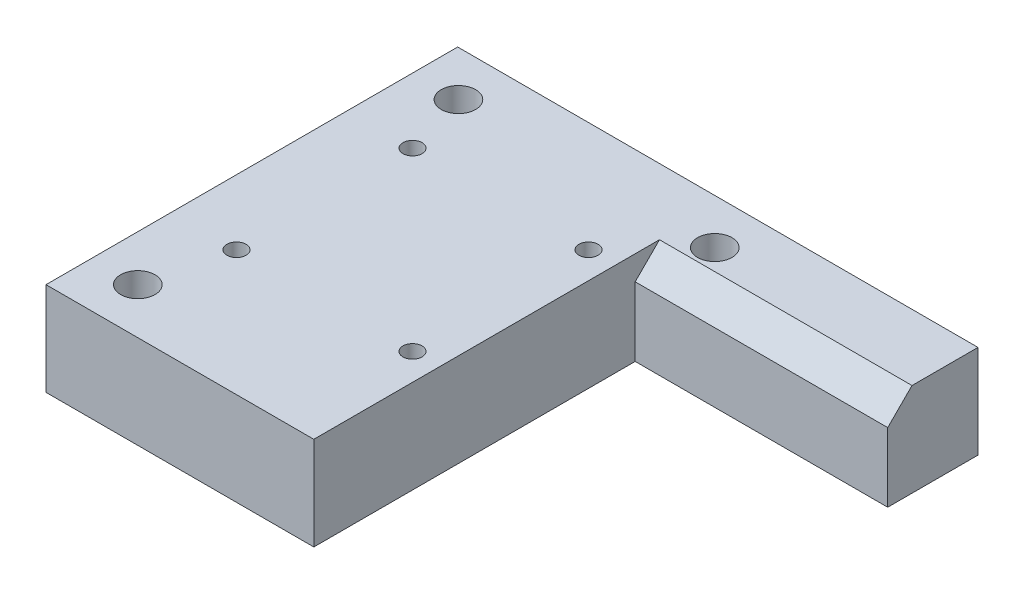
ISO-10303-21;
HEADER;
FILE_DESCRIPTION(('STEP AP214'),'2;1');
FILE_NAME('part.step','',(''),(''),'','','');
FILE_SCHEMA(('AUTOMOTIVE_DESIGN { 1 0 10303 214 1 1 1 1 }'));
ENDSEC;
DATA;
#1=APPLICATION_CONTEXT('core data for automotive mechanical design processes');
#2=APPLICATION_PROTOCOL_DEFINITION('international standard','automotive_design',2000,#1);
#3=PRODUCT_CONTEXT('',#1,'mechanical');
#4=PRODUCT('Part','Part','',(#3));
#5=PRODUCT_RELATED_PRODUCT_CATEGORY('part','',(#4));
#6=PRODUCT_DEFINITION_FORMATION('','',#4);
#7=PRODUCT_DEFINITION_CONTEXT('part definition',#1,'design');
#8=PRODUCT_DEFINITION('design','',#6,#7);
#9=PRODUCT_DEFINITION_SHAPE('','',#8);
#10=(LENGTH_UNIT() NAMED_UNIT(*) SI_UNIT(.MILLI.,.METRE.));
#11=(NAMED_UNIT(*) PLANE_ANGLE_UNIT() SI_UNIT($,.RADIAN.));
#12=(NAMED_UNIT(*) SI_UNIT($,.STERADIAN.) SOLID_ANGLE_UNIT());
#13=UNCERTAINTY_MEASURE_WITH_UNIT(LENGTH_MEASURE(1.E-05),#10,'distance_accuracy_value','');
#14=(GEOMETRIC_REPRESENTATION_CONTEXT(3) GLOBAL_UNCERTAINTY_ASSIGNED_CONTEXT((#13)) GLOBAL_UNIT_ASSIGNED_CONTEXT((#10,
#11,#12)) REPRESENTATION_CONTEXT('',''));
#15=CARTESIAN_POINT('',(0.,0.,0.));
#16=DIRECTION('',(0.,0.,1.));
#17=DIRECTION('',(1.,0.,0.));
#18=AXIS2_PLACEMENT_3D('',#15,#16,#17);
#19=CARTESIAN_POINT('',(0.,0.,11.8));
#20=DIRECTION('',(1.,0.,0.));
#21=DIRECTION('',(0.,1.,0.));
#22=AXIS2_PLACEMENT_3D('',#19,#20,#21);
#23=PLANE('',#22);
#24=DIRECTION('',(0.,-1.,0.));
#25=VECTOR('',#24,1.);
#26=CARTESIAN_POINT('',(0.,0.,0.));
#27=LINE('',#26,#25);
#28=CARTESIAN_POINT('',(0.,12.192,0.));
#29=VERTEX_POINT('',#28);
#30=CARTESIAN_POINT('',(0.,0.,0.));
#31=VERTEX_POINT('',#30);
#32=EDGE_CURVE('E111',#29,#31,#27,.T.);
#33=ORIENTED_EDGE('',*,*,#32,.T.);
#34=DIRECTION('',(0.,0.,1.));
#35=VECTOR('',#34,1.);
#36=CARTESIAN_POINT('',(0.,0.,0.));
#37=LINE('',#36,#35);
#38=CARTESIAN_POINT('',(0.,0.,53.8));
#39=VERTEX_POINT('',#38);
#40=EDGE_CURVE('E95',#31,#39,#37,.T.);
#41=ORIENTED_EDGE('',*,*,#40,.T.);
#42=DIRECTION('',(0.,-1.,0.));
#43=VECTOR('',#42,1.);
#44=CARTESIAN_POINT('',(0.,0.,53.8));
#45=LINE('',#44,#43);
#46=CARTESIAN_POINT('',(0.,12.192,53.8));
#47=VERTEX_POINT('',#46);
#48=EDGE_CURVE('E120',#47,#39,#45,.T.);
#49=ORIENTED_EDGE('',*,*,#48,.F.);
#50=DIRECTION('',(0.,0.,-1.));
#51=VECTOR('',#50,1.);
#52=CARTESIAN_POINT('',(0.,12.192,11.8));
#53=LINE('',#52,#51);
#54=EDGE_CURVE('E116',#47,#29,#53,.T.);
#55=ORIENTED_EDGE('',*,*,#54,.T.);
#56=EDGE_LOOP('',(#33,#41,#49,#55));
#57=FACE_BOUND('',#56,.T.);
#58=ADVANCED_FACE('F36',(#57),#23,.F.);
#59=CARTESIAN_POINT('',(68.,0.,11.8));
#60=DIRECTION('',(-1.,0.,0.));
#61=DIRECTION('',(0.,0.,1.));
#62=AXIS2_PLACEMENT_3D('',#59,#60,#61);
#63=PLANE('',#62);
#64=DIRECTION('',(0.,1.,0.));
#65=VECTOR('',#64,1.);
#66=CARTESIAN_POINT('',(68.,0.,11.8));
#67=LINE('',#66,#65);
#68=CARTESIAN_POINT('',(68.,0.,11.8));
#69=VERTEX_POINT('',#68);
#70=CARTESIAN_POINT('',(68.,9.017,11.8));
#71=VERTEX_POINT('',#70);
#72=EDGE_CURVE('E11',#69,#71,#67,.T.);
#73=ORIENTED_EDGE('',*,*,#72,.F.);
#74=DIRECTION('',(0.,0.,-1.));
#75=VECTOR('',#74,1.);
#76=CARTESIAN_POINT('',(68.,0.,11.8));
#77=LINE('',#76,#75);
#78=CARTESIAN_POINT('',(68.,0.,0.));
#79=VERTEX_POINT('',#78);
#80=EDGE_CURVE('E144',#69,#79,#77,.T.);
#81=ORIENTED_EDGE('',*,*,#80,.T.);
#82=DIRECTION('',(0.,1.,0.));
#83=VECTOR('',#82,1.);
#84=CARTESIAN_POINT('',(68.,0.,0.));
#85=LINE('',#84,#83);
#86=CARTESIAN_POINT('',(68.,12.192,0.));
#87=VERTEX_POINT('',#86);
#88=EDGE_CURVE('E45',#79,#87,#85,.T.);
#89=ORIENTED_EDGE('',*,*,#88,.T.);
#90=DIRECTION('',(0.,0.,-1.));
#91=VECTOR('',#90,1.);
#92=CARTESIAN_POINT('',(68.,12.192,11.8));
#93=LINE('',#92,#91);
#94=CARTESIAN_POINT('',(68.,12.192,8.62499999999999));
#95=VERTEX_POINT('',#94);
#96=EDGE_CURVE('E191',#95,#87,#93,.T.);
#97=ORIENTED_EDGE('',*,*,#96,.F.);
#98=DIRECTION('',(0.,0.707106781186546,-0.707106781186549));
#99=VECTOR('',#98,1.);
#100=CARTESIAN_POINT('',(68.,9.017,11.8));
#101=LINE('',#100,#99);
#102=EDGE_CURVE('E208',#71,#95,#101,.T.);
#103=ORIENTED_EDGE('',*,*,#102,.F.);
#104=EDGE_LOOP('',(#73,#81,#89,#97,#103));
#105=FACE_BOUND('',#104,.T.);
#106=ADVANCED_FACE('F229',(#105),#63,.F.);
#107=CARTESIAN_POINT('',(0.,0.,11.8));
#108=DIRECTION('',(0.,0.,1.));
#109=DIRECTION('',(1.,0.,0.));
#110=AXIS2_PLACEMENT_3D('',#107,#108,#109);
#111=PLANE('',#110);
#112=DIRECTION('',(-1.,0.,0.));
#113=VECTOR('',#112,1.);
#114=CARTESIAN_POINT('',(0.,0.,11.8));
#115=LINE('',#114,#113);
#116=CARTESIAN_POINT('',(35.,0.,11.8));
#117=VERTEX_POINT('',#116);
#118=EDGE_CURVE('E142',#69,#117,#115,.T.);
#119=ORIENTED_EDGE('',*,*,#118,.F.);
#120=ORIENTED_EDGE('',*,*,#72,.T.);
#121=DIRECTION('',(1.,0.,0.));
#122=VECTOR('',#121,1.);
#123=CARTESIAN_POINT('',(68.,9.017,11.8));
#124=LINE('',#123,#122);
#125=CARTESIAN_POINT('',(35.,9.017,11.8));
#126=VERTEX_POINT('',#125);
#127=EDGE_CURVE('E195',#126,#71,#124,.T.);
#128=ORIENTED_EDGE('',*,*,#127,.F.);
#129=DIRECTION('',(0.,1.,0.));
#130=VECTOR('',#129,1.);
#131=CARTESIAN_POINT('',(35.,0.,11.8));
#132=LINE('',#131,#130);
#133=EDGE_CURVE('E39',#117,#126,#132,.T.);
#134=ORIENTED_EDGE('',*,*,#133,.F.);
#135=EDGE_LOOP('',(#119,#120,#128,#134));
#136=FACE_BOUND('',#135,.T.);
#137=ADVANCED_FACE('F226',(#136),#111,.T.);
#138=CARTESIAN_POINT('',(0.,0.,0.));
#139=DIRECTION('',(0.,0.,1.));
#140=DIRECTION('',(1.,0.,0.));
#141=AXIS2_PLACEMENT_3D('',#138,#139,#140);
#142=PLANE('',#141);
#143=ORIENTED_EDGE('',*,*,#88,.F.);
#144=DIRECTION('',(-1.,0.,0.));
#145=VECTOR('',#144,1.);
#146=CARTESIAN_POINT('',(0.,0.,0.));
#147=LINE('',#146,#145);
#148=EDGE_CURVE('E99',#79,#31,#147,.T.);
#149=ORIENTED_EDGE('',*,*,#148,.T.);
#150=ORIENTED_EDGE('',*,*,#32,.F.);
#151=DIRECTION('',(1.,0.,0.));
#152=VECTOR('',#151,1.);
#153=CARTESIAN_POINT('',(0.,12.192,0.));
#154=LINE('',#153,#152);
#155=EDGE_CURVE('E189',#29,#87,#154,.T.);
#156=ORIENTED_EDGE('',*,*,#155,.T.);
#157=EDGE_LOOP('',(#143,#149,#150,#156));
#158=FACE_BOUND('',#157,.T.);
#159=ADVANCED_FACE('F109',(#158),#142,.F.);
#160=CARTESIAN_POINT('',(39.5,-7.,5.9));
#161=DIRECTION('',(0.,1.,0.));
#162=DIRECTION('',(0.,0.,1.));
#163=AXIS2_PLACEMENT_3D('',#160,#161,#162);
#164=CYLINDRICAL_SURFACE('',#163,4.125);
#165=CARTESIAN_POINT('',(39.5,0.,5.9));
#166=DIRECTION('',(0.,1.,0.));
#167=DIRECTION('',(0.,0.,1.));
#168=AXIS2_PLACEMENT_3D('',#165,#166,#167);
#169=CIRCLE('',#168,4.125);
#170=CARTESIAN_POINT('',(39.5,0.,10.025));
#171=VERTEX_POINT('',#170);
#172=EDGE_CURVE('E149',#171,#171,#169,.F.);
#173=ORIENTED_EDGE('',*,*,#172,.T.);
#174=EDGE_LOOP('',(#173));
#175=FACE_BOUND('',#174,.T.);
#176=CARTESIAN_POINT('',(39.5,7.,5.9));
#177=DIRECTION('',(0.,1.,0.));
#178=DIRECTION('',(0.,0.,1.));
#179=AXIS2_PLACEMENT_3D('',#176,#177,#178);
#180=CIRCLE('',#179,4.125);
#181=CARTESIAN_POINT('',(39.5,7.,10.025));
#182=VERTEX_POINT('',#181);
#183=EDGE_CURVE('E179',#182,#182,#180,.T.);
#184=ORIENTED_EDGE('',*,*,#183,.T.);
#185=EDGE_LOOP('',(#184));
#186=FACE_BOUND('',#185,.T.);
#187=ADVANCED_FACE('F256',(#175,#186),#164,.F.);
#188=CARTESIAN_POINT('',(6.,-7.,5.90000000000001));
#189=DIRECTION('',(0.,1.,0.));
#190=DIRECTION('',(0.,0.,1.));
#191=AXIS2_PLACEMENT_3D('',#188,#189,#190);
#192=CYLINDRICAL_SURFACE('',#191,4.125);
#193=CARTESIAN_POINT('',(6.,0.,5.90000000000001));
#194=DIRECTION('',(0.,1.,0.));
#195=DIRECTION('',(0.,0.,1.));
#196=AXIS2_PLACEMENT_3D('',#193,#194,#195);
#197=CIRCLE('',#196,4.125);
#198=CARTESIAN_POINT('',(6.,0.,10.025));
#199=VERTEX_POINT('',#198);
#200=EDGE_CURVE('E146',#199,#199,#197,.F.);
#201=ORIENTED_EDGE('',*,*,#200,.T.);
#202=EDGE_LOOP('',(#201));
#203=FACE_BOUND('',#202,.T.);
#204=CARTESIAN_POINT('',(6.,7.,5.90000000000001));
#205=DIRECTION('',(0.,1.,0.));
#206=DIRECTION('',(0.,0.,1.));
#207=AXIS2_PLACEMENT_3D('',#204,#205,#206);
#208=CIRCLE('',#207,4.125);
#209=CARTESIAN_POINT('',(6.,7.,10.025));
#210=VERTEX_POINT('',#209);
#211=EDGE_CURVE('E175',#210,#210,#208,.T.);
#212=ORIENTED_EDGE('',*,*,#211,.T.);
#213=EDGE_LOOP('',(#212));
#214=FACE_BOUND('',#213,.T.);
#215=ADVANCED_FACE('F244',(#203,#214),#192,.F.);
#216=CARTESIAN_POINT('',(35.,0.,53.8));
#217=DIRECTION('',(-1.,0.,0.));
#218=DIRECTION('',(0.,0.,1.));
#219=AXIS2_PLACEMENT_3D('',#216,#217,#218);
#220=PLANE('',#219);
#221=DIRECTION('',(0.,1.,0.));
#222=VECTOR('',#221,1.);
#223=CARTESIAN_POINT('',(35.,0.,53.8));
#224=LINE('',#223,#222);
#225=CARTESIAN_POINT('',(35.,0.,53.8));
#226=VERTEX_POINT('',#225);
#227=CARTESIAN_POINT('',(35.,12.192,53.8));
#228=VERTEX_POINT('',#227);
#229=EDGE_CURVE('E117',#226,#228,#224,.T.);
#230=ORIENTED_EDGE('',*,*,#229,.F.);
#231=DIRECTION('',(0.,0.,-1.));
#232=VECTOR('',#231,1.);
#233=CARTESIAN_POINT('',(35.,0.,53.8));
#234=LINE('',#233,#232);
#235=EDGE_CURVE('E53',#226,#117,#234,.T.);
#236=ORIENTED_EDGE('',*,*,#235,.T.);
#237=ORIENTED_EDGE('',*,*,#133,.T.);
#238=DIRECTION('',(0.,-0.707106781186546,0.707106781186549));
#239=VECTOR('',#238,1.);
#240=CARTESIAN_POINT('',(35.,-16.4915,37.3085000000001));
#241=LINE('',#240,#239);
#242=CARTESIAN_POINT('',(35.,12.192,8.62500000000001));
#243=VERTEX_POINT('',#242);
#244=EDGE_CURVE('E61',#243,#126,#241,.T.);
#245=ORIENTED_EDGE('',*,*,#244,.F.);
#246=DIRECTION('',(0.,0.,-1.));
#247=VECTOR('',#246,1.);
#248=CARTESIAN_POINT('',(35.,12.192,53.8));
#249=LINE('',#248,#247);
#250=EDGE_CURVE('E174',#228,#243,#249,.T.);
#251=ORIENTED_EDGE('',*,*,#250,.F.);
#252=EDGE_LOOP('',(#230,#236,#237,#245,#251));
#253=FACE_BOUND('',#252,.T.);
#254=ADVANCED_FACE('F218',(#253),#220,.F.);
#255=CARTESIAN_POINT('',(0.,0.,53.8));
#256=DIRECTION('',(0.,0.,1.));
#257=DIRECTION('',(1.,0.,0.));
#258=AXIS2_PLACEMENT_3D('',#255,#256,#257);
#259=PLANE('',#258);
#260=DIRECTION('',(-1.,0.,0.));
#261=VECTOR('',#260,1.);
#262=CARTESIAN_POINT('',(0.,0.,53.8));
#263=LINE('',#262,#261);
#264=EDGE_CURVE('E101',#226,#39,#263,.T.);
#265=ORIENTED_EDGE('',*,*,#264,.F.);
#266=ORIENTED_EDGE('',*,*,#229,.T.);
#267=DIRECTION('',(1.,0.,0.));
#268=VECTOR('',#267,1.);
#269=CARTESIAN_POINT('',(0.,12.192,53.8));
#270=LINE('',#269,#268);
#271=EDGE_CURVE('E171',#47,#228,#270,.T.);
#272=ORIENTED_EDGE('',*,*,#271,.F.);
#273=ORIENTED_EDGE('',*,*,#48,.T.);
#274=EDGE_LOOP('',(#265,#266,#272,#273));
#275=FACE_BOUND('',#274,.T.);
#276=ADVANCED_FACE('F233',(#275),#259,.T.);
#277=CARTESIAN_POINT('',(6.,-7.,47.8));
#278=DIRECTION('',(0.,1.,0.));
#279=DIRECTION('',(0.,0.,1.));
#280=AXIS2_PLACEMENT_3D('',#277,#278,#279);
#281=CYLINDRICAL_SURFACE('',#280,4.125);
#282=CARTESIAN_POINT('',(6.,0.,47.8));
#283=DIRECTION('',(0.,1.,0.));
#284=DIRECTION('',(0.,0.,1.));
#285=AXIS2_PLACEMENT_3D('',#282,#283,#284);
#286=CIRCLE('',#285,4.125);
#287=CARTESIAN_POINT('',(6.,0.,51.925));
#288=VERTEX_POINT('',#287);
#289=EDGE_CURVE('E138',#288,#288,#286,.F.);
#290=ORIENTED_EDGE('',*,*,#289,.T.);
#291=EDGE_LOOP('',(#290));
#292=FACE_BOUND('',#291,.T.);
#293=CARTESIAN_POINT('',(6.,7.,47.8));
#294=DIRECTION('',(0.,1.,0.));
#295=DIRECTION('',(0.,0.,1.));
#296=AXIS2_PLACEMENT_3D('',#293,#294,#295);
#297=CIRCLE('',#296,4.125);
#298=CARTESIAN_POINT('',(6.,7.,51.925));
#299=VERTEX_POINT('',#298);
#300=EDGE_CURVE('E164',#299,#299,#297,.T.);
#301=ORIENTED_EDGE('',*,*,#300,.T.);
#302=EDGE_LOOP('',(#301));
#303=FACE_BOUND('',#302,.T.);
#304=ADVANCED_FACE('F235',(#292,#303),#281,.F.);
#305=CARTESIAN_POINT('',(8.50000000000008,-12.19305,14.4002415116128));
#306=DIRECTION('',(0.,1.,0.));
#307=DIRECTION('',(0.,0.,1.));
#308=AXIS2_PLACEMENT_3D('',#305,#306,#307);
#309=CYLINDRICAL_SURFACE('',#308,1.24999999999369);
#310=CARTESIAN_POINT('',(8.50000000000008,0.,14.4002415116128));
#311=DIRECTION('',(0.,1.,0.));
#312=DIRECTION('',(0.,0.,1.));
#313=AXIS2_PLACEMENT_3D('',#310,#311,#312);
#314=CIRCLE('',#313,1.24999999999369);
#315=CARTESIAN_POINT('',(8.50000000000008,0.,15.6502415116065));
#316=VERTEX_POINT('',#315);
#317=EDGE_CURVE('E132',#316,#316,#314,.F.);
#318=ORIENTED_EDGE('',*,*,#317,.T.);
#319=EDGE_LOOP('',(#318));
#320=FACE_BOUND('',#319,.T.);
#321=CARTESIAN_POINT('',(8.50000000000008,12.192,14.4002415116128));
#322=DIRECTION('',(0.,1.,0.));
#323=DIRECTION('',(0.,0.,1.));
#324=AXIS2_PLACEMENT_3D('',#321,#322,#323);
#325=CIRCLE('',#324,1.24999999999369);
#326=CARTESIAN_POINT('',(8.50000000000008,12.192,15.6502415116065));
#327=VERTEX_POINT('',#326);
#328=EDGE_CURVE('E161',#327,#327,#325,.F.);
#329=ORIENTED_EDGE('',*,*,#328,.F.);
#330=EDGE_LOOP('',(#329));
#331=FACE_BOUND('',#330,.T.);
#332=ADVANCED_FACE('F241',(#320,#331),#309,.F.);
#333=CARTESIAN_POINT('',(8.497816511636,-12.19305,37.4024249999771));
#334=DIRECTION('',(0.,1.,0.));
#335=DIRECTION('',(0.,0.,1.));
#336=AXIS2_PLACEMENT_3D('',#333,#334,#335);
#337=CYLINDRICAL_SURFACE('',#336,1.2499999999937);
#338=CARTESIAN_POINT('',(8.497816511636,0.,37.4024249999771));
#339=DIRECTION('',(0.,1.,0.));
#340=DIRECTION('',(0.,0.,1.));
#341=AXIS2_PLACEMENT_3D('',#338,#339,#340);
#342=CIRCLE('',#341,1.2499999999937);
#343=CARTESIAN_POINT('',(8.497816511636,0.,38.6524249999708));
#344=VERTEX_POINT('',#343);
#345=EDGE_CURVE('E127',#344,#344,#342,.F.);
#346=ORIENTED_EDGE('',*,*,#345,.T.);
#347=EDGE_LOOP('',(#346));
#348=FACE_BOUND('',#347,.T.);
#349=CARTESIAN_POINT('',(8.497816511636,12.192,37.4024249999771));
#350=DIRECTION('',(0.,1.,0.));
#351=DIRECTION('',(0.,0.,1.));
#352=AXIS2_PLACEMENT_3D('',#349,#350,#351);
#353=CIRCLE('',#352,1.2499999999937);
#354=CARTESIAN_POINT('',(8.497816511636,12.192,38.6524249999708));
#355=VERTEX_POINT('',#354);
#356=EDGE_CURVE('E158',#355,#355,#353,.F.);
#357=ORIENTED_EDGE('',*,*,#356,.F.);
#358=EDGE_LOOP('',(#357));
#359=FACE_BOUND('',#358,.T.);
#360=ADVANCED_FACE('F304',(#348,#359),#337,.F.);
#361=CARTESIAN_POINT('',(31.5000000000003,-12.19305,37.4046084883411));
#362=DIRECTION('',(0.,1.,0.));
#363=DIRECTION('',(0.,0.,1.));
#364=AXIS2_PLACEMENT_3D('',#361,#362,#363);
#365=CYLINDRICAL_SURFACE('',#364,1.24999999999371);
#366=CARTESIAN_POINT('',(31.5000000000003,0.,37.4046084883411));
#367=DIRECTION('',(0.,1.,0.));
#368=DIRECTION('',(0.,0.,1.));
#369=AXIS2_PLACEMENT_3D('',#366,#367,#368);
#370=CIRCLE('',#369,1.24999999999371);
#371=CARTESIAN_POINT('',(31.5000000000003,0.,38.6546084883348));
#372=VERTEX_POINT('',#371);
#373=EDGE_CURVE('E123',#372,#372,#370,.F.);
#374=ORIENTED_EDGE('',*,*,#373,.T.);
#375=EDGE_LOOP('',(#374));
#376=FACE_BOUND('',#375,.T.);
#377=CARTESIAN_POINT('',(31.5000000000003,12.192,37.4046084883411));
#378=DIRECTION('',(0.,1.,0.));
#379=DIRECTION('',(0.,0.,1.));
#380=AXIS2_PLACEMENT_3D('',#377,#378,#379);
#381=CIRCLE('',#380,1.24999999999371);
#382=CARTESIAN_POINT('',(31.5000000000003,12.192,38.6546084883348));
#383=VERTEX_POINT('',#382);
#384=EDGE_CURVE('E155',#383,#383,#381,.F.);
#385=ORIENTED_EDGE('',*,*,#384,.F.);
#386=EDGE_LOOP('',(#385));
#387=FACE_BOUND('',#386,.T.);
#388=ADVANCED_FACE('F301',(#376,#387),#365,.F.);
#389=CARTESIAN_POINT('',(31.5021834883644,-12.19305,14.402424999977));
#390=DIRECTION('',(0.,1.,0.));
#391=DIRECTION('',(0.,0.,1.));
#392=AXIS2_PLACEMENT_3D('',#389,#390,#391);
#393=CYLINDRICAL_SURFACE('',#392,1.2499999999937);
#394=CARTESIAN_POINT('',(31.5021834883644,0.,14.402424999977));
#395=DIRECTION('',(0.,1.,0.));
#396=DIRECTION('',(0.,0.,1.));
#397=AXIS2_PLACEMENT_3D('',#394,#395,#396);
#398=CIRCLE('',#397,1.2499999999937);
#399=CARTESIAN_POINT('',(31.5021834883644,0.,15.6524249999707));
#400=VERTEX_POINT('',#399);
#401=EDGE_CURVE('E105',#400,#400,#398,.F.);
#402=ORIENTED_EDGE('',*,*,#401,.T.);
#403=EDGE_LOOP('',(#402));
#404=FACE_BOUND('',#403,.T.);
#405=CARTESIAN_POINT('',(31.5021834883644,12.192,14.402424999977));
#406=DIRECTION('',(0.,1.,0.));
#407=DIRECTION('',(0.,0.,1.));
#408=AXIS2_PLACEMENT_3D('',#405,#406,#407);
#409=CIRCLE('',#408,1.2499999999937);
#410=CARTESIAN_POINT('',(31.5021834883644,12.192,15.6524249999707));
#411=VERTEX_POINT('',#410);
#412=EDGE_CURVE('E152',#411,#411,#409,.F.);
#413=ORIENTED_EDGE('',*,*,#412,.F.);
#414=EDGE_LOOP('',(#413));
#415=FACE_BOUND('',#414,.T.);
#416=ADVANCED_FACE('F289',(#404,#415),#393,.F.);
#417=CARTESIAN_POINT('',(6.,12.19205,47.8));
#418=DIRECTION('',(0.,-1.,0.));
#419=DIRECTION('',(0.,0.,1.));
#420=AXIS2_PLACEMENT_3D('',#417,#418,#419);
#421=CYLINDRICAL_SURFACE('',#420,2.25000000000001);
#422=CARTESIAN_POINT('',(6.,12.192,47.8));
#423=DIRECTION('',(0.,1.,0.));
#424=DIRECTION('',(0.,0.,1.));
#425=AXIS2_PLACEMENT_3D('',#422,#423,#424);
#426=CIRCLE('',#425,2.25000000000001);
#427=CARTESIAN_POINT('',(6.,12.192,50.05));
#428=VERTEX_POINT('',#427);
#429=EDGE_CURVE('E168',#428,#428,#426,.T.);
#430=CARTESIAN_POINT('',(6.,7.,47.8));
#431=DIRECTION('',(0.,1.,0.));
#432=DIRECTION('',(0.,0.,1.));
#433=AXIS2_PLACEMENT_3D('',#430,#431,#432);
#434=CIRCLE('',#433,2.25000000000001);
#435=CARTESIAN_POINT('',(6.,7.,50.05));
#436=VERTEX_POINT('',#435);
#437=EDGE_CURVE('E167',#436,#436,#434,.F.);
#438=CARTESIAN_POINT('',(6.,12.192,50.05));
#439=CARTESIAN_POINT('',(6.,12.1379166666667,50.05));
#440=CARTESIAN_POINT('',(6.,12.0838333333333,50.05));
#441=CARTESIAN_POINT('',(6.,11.9756666666667,50.05));
#442=CARTESIAN_POINT('',(6.,11.9215833333333,50.05));
#443=CARTESIAN_POINT('',(6.,11.8134166666667,50.05));
#444=CARTESIAN_POINT('',(6.,11.7593333333333,50.05));
#445=CARTESIAN_POINT('',(6.,11.6511666666667,50.05));
#446=CARTESIAN_POINT('',(6.,11.5970833333333,50.05));
#447=CARTESIAN_POINT('',(6.,11.4889166666667,50.05));
#448=CARTESIAN_POINT('',(6.,11.4348333333333,50.05));
#449=CARTESIAN_POINT('',(6.,11.3266666666667,50.05));
#450=CARTESIAN_POINT('',(6.,11.2725833333333,50.05));
#451=CARTESIAN_POINT('',(6.,11.1644166666667,50.05));
#452=CARTESIAN_POINT('',(6.,11.1103333333333,50.05));
#453=CARTESIAN_POINT('',(6.,11.0021666666667,50.05));
#454=CARTESIAN_POINT('',(6.,10.9480833333333,50.05));
#455=CARTESIAN_POINT('',(6.,10.8399166666667,50.05));
#456=CARTESIAN_POINT('',(6.,10.7858333333333,50.05));
#457=CARTESIAN_POINT('',(6.,10.6776666666667,50.05));
#458=CARTESIAN_POINT('',(6.,10.6235833333333,50.05));
#459=CARTESIAN_POINT('',(6.,10.5154166666667,50.05));
#460=CARTESIAN_POINT('',(6.,10.4613333333333,50.05));
#461=CARTESIAN_POINT('',(6.,10.3531666666667,50.05));
#462=CARTESIAN_POINT('',(6.,10.2990833333333,50.05));
#463=CARTESIAN_POINT('',(6.,10.1909166666667,50.05));
#464=CARTESIAN_POINT('',(6.,10.1368333333333,50.05));
#465=CARTESIAN_POINT('',(6.,10.0286666666667,50.05));
#466=CARTESIAN_POINT('',(6.,9.97458333333333,50.05));
#467=CARTESIAN_POINT('',(6.,9.86641666666667,50.05));
#468=CARTESIAN_POINT('',(6.,9.81233333333333,50.05));
#469=CARTESIAN_POINT('',(6.,9.70416666666667,50.05));
#470=CARTESIAN_POINT('',(6.,9.65008333333333,50.05));
#471=CARTESIAN_POINT('',(6.,9.54191666666667,50.05));
#472=CARTESIAN_POINT('',(6.,9.48783333333333,50.05));
#473=CARTESIAN_POINT('',(6.,9.37966666666667,50.05));
#474=CARTESIAN_POINT('',(6.,9.32558333333333,50.05));
#475=CARTESIAN_POINT('',(6.,9.21741666666667,50.05));
#476=CARTESIAN_POINT('',(6.,9.16333333333333,50.05));
#477=CARTESIAN_POINT('',(6.,9.05516666666667,50.05));
#478=CARTESIAN_POINT('',(6.,9.00108333333333,50.05));
#479=CARTESIAN_POINT('',(6.,8.89291666666667,50.05));
#480=CARTESIAN_POINT('',(6.,8.83883333333333,50.05));
#481=CARTESIAN_POINT('',(6.,8.73066666666667,50.05));
#482=CARTESIAN_POINT('',(6.,8.67658333333333,50.05));
#483=CARTESIAN_POINT('',(6.,8.56841666666667,50.05));
#484=CARTESIAN_POINT('',(6.,8.51433333333333,50.05));
#485=CARTESIAN_POINT('',(6.,8.40616666666667,50.05));
#486=CARTESIAN_POINT('',(6.,8.35208333333333,50.05));
#487=CARTESIAN_POINT('',(6.,8.24391666666667,50.05));
#488=CARTESIAN_POINT('',(6.,8.18983333333333,50.05));
#489=CARTESIAN_POINT('',(6.,8.08166666666667,50.05));
#490=CARTESIAN_POINT('',(6.,8.02758333333333,50.05));
#491=CARTESIAN_POINT('',(6.,7.91941666666667,50.05));
#492=CARTESIAN_POINT('',(6.,7.86533333333333,50.05));
#493=CARTESIAN_POINT('',(6.,7.75716666666667,50.05));
#494=CARTESIAN_POINT('',(6.,7.70308333333333,50.05));
#495=CARTESIAN_POINT('',(6.,7.59491666666667,50.05));
#496=CARTESIAN_POINT('',(6.,7.54083333333333,50.05));
#497=CARTESIAN_POINT('',(6.,7.43266666666667,50.05));
#498=CARTESIAN_POINT('',(6.,7.37858333333333,50.05));
#499=CARTESIAN_POINT('',(6.,7.27041666666667,50.05));
#500=CARTESIAN_POINT('',(6.,7.21633333333333,50.05));
#501=CARTESIAN_POINT('',(6.,7.10816666666667,50.05));
#502=CARTESIAN_POINT('',(6.,7.05408333333333,50.05));
#503=CARTESIAN_POINT('',(6.,7.,50.05));
#504=B_SPLINE_CURVE_WITH_KNOTS('',3,(#438,#439,#440,#441,#442,#443,#444,#445,#446,#447,#448,
#449,#450,#451,#452,#453,#454,#455,#456,#457,#458,#459,#460,#461,#462,#463,#464,#465,#466,#467,
#468,#469,#470,#471,#472,#473,#474,#475,#476,#477,#478,#479,#480,#481,#482,#483,#484,#485,#486,
#487,#488,#489,#490,#491,#492,#493,#494,#495,#496,#497,#498,#499,#500,#501,#502,#503),
.UNSPECIFIED.,.F.,.F.,(4,2,2,2,2,2,2,2,2,2,2,2,2,2,2,2,2,2,2,2,2,2,2,2,2,2,2,2,2,2,2,2,4),(0.,
0.162250000000001,0.3245,0.486750000000001,0.649,0.811250000000001,0.9735,1.13575,1.298,1.46025,
1.6225,1.78475,1.947,2.10925,2.2715,2.43375,2.596,2.75825,2.9205,3.08275,3.245,3.40725,3.5695,
3.73175,3.894,4.05625,4.2185,4.38075,4.543,4.70525,4.8675,5.02975,5.192),.UNSPECIFIED.);
#505=EDGE_CURVE('BSEAM280',#428,#436,#504,.T.);
#506=ORIENTED_EDGE('',*,*,#429,.T.);
#507=ORIENTED_EDGE('',*,*,#437,.T.);
#508=ORIENTED_EDGE('',*,*,#505,.T.);
#509=ORIENTED_EDGE('',*,*,#505,.F.);
#510=EDGE_LOOP('',(#506,#508,#507,#509));
#511=FACE_BOUND('',#510,.T.);
#512=ADVANCED_FACE('F280',(#511),#421,.F.);
#513=CARTESIAN_POINT('',(6.,12.192,5.90000000000001));
#514=DIRECTION('',(0.,-1.,0.));
#515=DIRECTION('',(0.,0.,1.));
#516=AXIS2_PLACEMENT_3D('',#513,#514,#515);
#517=CYLINDRICAL_SURFACE('',#516,2.25);
#518=CARTESIAN_POINT('',(6.,12.192,5.90000000000001));
#519=DIRECTION('',(0.,1.,0.));
#520=DIRECTION('',(0.,0.,1.));
#521=AXIS2_PLACEMENT_3D('',#518,#519,#520);
#522=CIRCLE('',#521,2.25);
#523=CARTESIAN_POINT('',(6.,12.192,8.15000000000001));
#524=VERTEX_POINT('',#523);
#525=EDGE_CURVE('E183',#524,#524,#522,.T.);
#526=CARTESIAN_POINT('',(6.,7.,5.90000000000001));
#527=DIRECTION('',(0.,1.,0.));
#528=DIRECTION('',(0.,0.,1.));
#529=AXIS2_PLACEMENT_3D('',#526,#527,#528);
#530=CIRCLE('',#529,2.25);
#531=CARTESIAN_POINT('',(6.,7.,8.15000000000001));
#532=VERTEX_POINT('',#531);
#533=EDGE_CURVE('E178',#532,#532,#530,.F.);
#534=CARTESIAN_POINT('',(6.,12.192,8.15000000000001));
#535=CARTESIAN_POINT('',(6.,12.1379166666667,8.15000000000001));
#536=CARTESIAN_POINT('',(6.,12.0838333333333,8.15000000000001));
#537=CARTESIAN_POINT('',(6.,11.9756666666667,8.15000000000001));
#538=CARTESIAN_POINT('',(6.,11.9215833333333,8.15000000000001));
#539=CARTESIAN_POINT('',(6.,11.8134166666667,8.15000000000001));
#540=CARTESIAN_POINT('',(6.,11.7593333333333,8.15000000000001));
#541=CARTESIAN_POINT('',(6.,11.6511666666667,8.15000000000001));
#542=CARTESIAN_POINT('',(6.,11.5970833333333,8.15000000000001));
#543=CARTESIAN_POINT('',(6.,11.4889166666667,8.15000000000001));
#544=CARTESIAN_POINT('',(6.,11.4348333333333,8.15000000000001));
#545=CARTESIAN_POINT('',(6.,11.3266666666667,8.15000000000001));
#546=CARTESIAN_POINT('',(6.,11.2725833333333,8.15000000000001));
#547=CARTESIAN_POINT('',(6.,11.1644166666667,8.15000000000001));
#548=CARTESIAN_POINT('',(6.,11.1103333333333,8.15000000000001));
#549=CARTESIAN_POINT('',(6.,11.0021666666667,8.15000000000001));
#550=CARTESIAN_POINT('',(6.,10.9480833333333,8.15000000000001));
#551=CARTESIAN_POINT('',(6.,10.8399166666667,8.15000000000001));
#552=CARTESIAN_POINT('',(6.,10.7858333333333,8.15000000000001));
#553=CARTESIAN_POINT('',(6.,10.6776666666667,8.15000000000001));
#554=CARTESIAN_POINT('',(6.,10.6235833333333,8.15000000000001));
#555=CARTESIAN_POINT('',(6.,10.5154166666667,8.15000000000001));
#556=CARTESIAN_POINT('',(6.,10.4613333333333,8.15000000000001));
#557=CARTESIAN_POINT('',(6.,10.3531666666667,8.15000000000001));
#558=CARTESIAN_POINT('',(6.,10.2990833333333,8.15000000000001));
#559=CARTESIAN_POINT('',(6.,10.1909166666667,8.15000000000001));
#560=CARTESIAN_POINT('',(6.,10.1368333333333,8.15000000000001));
#561=CARTESIAN_POINT('',(6.,10.0286666666667,8.15000000000001));
#562=CARTESIAN_POINT('',(6.,9.97458333333333,8.15000000000001));
#563=CARTESIAN_POINT('',(6.,9.86641666666667,8.15000000000001));
#564=CARTESIAN_POINT('',(6.,9.81233333333333,8.15000000000001));
#565=CARTESIAN_POINT('',(6.,9.70416666666667,8.15000000000001));
#566=CARTESIAN_POINT('',(6.,9.65008333333333,8.15000000000001));
#567=CARTESIAN_POINT('',(6.,9.54191666666667,8.15000000000001));
#568=CARTESIAN_POINT('',(6.,9.48783333333333,8.15000000000001));
#569=CARTESIAN_POINT('',(6.,9.37966666666667,8.15000000000001));
#570=CARTESIAN_POINT('',(6.,9.32558333333333,8.15000000000001));
#571=CARTESIAN_POINT('',(6.,9.21741666666667,8.15000000000001));
#572=CARTESIAN_POINT('',(6.,9.16333333333333,8.15000000000001));
#573=CARTESIAN_POINT('',(6.,9.05516666666667,8.15000000000001));
#574=CARTESIAN_POINT('',(6.,9.00108333333333,8.15000000000001));
#575=CARTESIAN_POINT('',(6.,8.89291666666667,8.15000000000001));
#576=CARTESIAN_POINT('',(6.,8.83883333333333,8.15000000000001));
#577=CARTESIAN_POINT('',(6.,8.73066666666667,8.15000000000001));
#578=CARTESIAN_POINT('',(6.,8.67658333333333,8.15000000000001));
#579=CARTESIAN_POINT('',(6.,8.56841666666667,8.15000000000001));
#580=CARTESIAN_POINT('',(6.,8.51433333333333,8.15000000000001));
#581=CARTESIAN_POINT('',(6.,8.40616666666667,8.15000000000001));
#582=CARTESIAN_POINT('',(6.,8.35208333333333,8.15000000000001));
#583=CARTESIAN_POINT('',(6.,8.24391666666667,8.15000000000001));
#584=CARTESIAN_POINT('',(6.,8.18983333333333,8.15000000000001));
#585=CARTESIAN_POINT('',(6.,8.08166666666667,8.15000000000001));
#586=CARTESIAN_POINT('',(6.,8.02758333333333,8.15000000000001));
#587=CARTESIAN_POINT('',(6.,7.91941666666667,8.15000000000001));
#588=CARTESIAN_POINT('',(6.,7.86533333333333,8.15000000000001));
#589=CARTESIAN_POINT('',(6.,7.75716666666667,8.15000000000001));
#590=CARTESIAN_POINT('',(6.,7.70308333333333,8.15000000000001));
#591=CARTESIAN_POINT('',(6.,7.59491666666667,8.15000000000001));
#592=CARTESIAN_POINT('',(6.,7.54083333333333,8.15000000000001));
#593=CARTESIAN_POINT('',(6.,7.43266666666667,8.15000000000001));
#594=CARTESIAN_POINT('',(6.,7.37858333333333,8.15000000000001));
#595=CARTESIAN_POINT('',(6.,7.27041666666667,8.15000000000001));
#596=CARTESIAN_POINT('',(6.,7.21633333333333,8.15000000000001));
#597=CARTESIAN_POINT('',(6.,7.10816666666667,8.15000000000001));
#598=CARTESIAN_POINT('',(6.,7.05408333333333,8.15000000000001));
#599=CARTESIAN_POINT('',(6.,7.,8.15000000000001));
#600=B_SPLINE_CURVE_WITH_KNOTS('',3,(#534,#535,#536,#537,#538,#539,#540,#541,#542,#543,#544,
#545,#546,#547,#548,#549,#550,#551,#552,#553,#554,#555,#556,#557,#558,#559,#560,#561,#562,#563,
#564,#565,#566,#567,#568,#569,#570,#571,#572,#573,#574,#575,#576,#577,#578,#579,#580,#581,#582,
#583,#584,#585,#586,#587,#588,#589,#590,#591,#592,#593,#594,#595,#596,#597,#598,#599),
.UNSPECIFIED.,.F.,.F.,(4,2,2,2,2,2,2,2,2,2,2,2,2,2,2,2,2,2,2,2,2,2,2,2,2,2,2,2,2,2,2,2,4),(0.,
0.162250000000001,0.3245,0.486750000000001,0.649,0.811250000000001,0.9735,1.13575,1.298,1.46025,
1.6225,1.78475,1.947,2.10925,2.2715,2.43375,2.596,2.75825,2.9205,3.08275,3.245,3.40725,3.5695,
3.73175,3.894,4.05625,4.2185,4.38075,4.543,4.70525,4.8675,5.02975,5.192),.UNSPECIFIED.);
#601=EDGE_CURVE('BSEAM277',#524,#532,#600,.T.);
#602=ORIENTED_EDGE('',*,*,#525,.T.);
#603=ORIENTED_EDGE('',*,*,#533,.T.);
#604=ORIENTED_EDGE('',*,*,#601,.T.);
#605=ORIENTED_EDGE('',*,*,#601,.F.);
#606=EDGE_LOOP('',(#602,#604,#603,#605));
#607=FACE_BOUND('',#606,.T.);
#608=ADVANCED_FACE('F277',(#607),#517,.F.);
#609=CARTESIAN_POINT('',(39.5,12.192,5.9));
#610=DIRECTION('',(0.,-1.,0.));
#611=DIRECTION('',(0.,0.,1.));
#612=AXIS2_PLACEMENT_3D('',#609,#610,#611);
#613=CYLINDRICAL_SURFACE('',#612,2.24999999999999);
#614=CARTESIAN_POINT('',(39.5,12.192,5.9));
#615=DIRECTION('',(0.,1.,0.));
#616=DIRECTION('',(0.,0.,1.));
#617=AXIS2_PLACEMENT_3D('',#614,#615,#616);
#618=CIRCLE('',#617,2.24999999999999);
#619=CARTESIAN_POINT('',(39.5,12.192,8.14999999999999));
#620=VERTEX_POINT('',#619);
#621=EDGE_CURVE('E186',#620,#620,#618,.T.);
#622=CARTESIAN_POINT('',(39.5,7.,5.9));
#623=DIRECTION('',(0.,1.,0.));
#624=DIRECTION('',(0.,0.,1.));
#625=AXIS2_PLACEMENT_3D('',#622,#623,#624);
#626=CIRCLE('',#625,2.24999999999999);
#627=CARTESIAN_POINT('',(39.5,7.,8.14999999999999));
#628=VERTEX_POINT('',#627);
#629=EDGE_CURVE('E182',#628,#628,#626,.F.);
#630=CARTESIAN_POINT('',(39.5,12.192,8.14999999999999));
#631=CARTESIAN_POINT('',(39.5,12.1379166666667,8.14999999999999));
#632=CARTESIAN_POINT('',(39.5,12.0838333333333,8.14999999999999));
#633=CARTESIAN_POINT('',(39.5,11.9756666666667,8.14999999999999));
#634=CARTESIAN_POINT('',(39.5,11.9215833333333,8.14999999999999));
#635=CARTESIAN_POINT('',(39.5,11.8134166666667,8.14999999999999));
#636=CARTESIAN_POINT('',(39.5,11.7593333333333,8.14999999999999));
#637=CARTESIAN_POINT('',(39.5,11.6511666666667,8.14999999999999));
#638=CARTESIAN_POINT('',(39.5,11.5970833333333,8.14999999999999));
#639=CARTESIAN_POINT('',(39.5,11.4889166666667,8.14999999999999));
#640=CARTESIAN_POINT('',(39.5,11.4348333333333,8.14999999999999));
#641=CARTESIAN_POINT('',(39.5,11.3266666666667,8.14999999999999));
#642=CARTESIAN_POINT('',(39.5,11.2725833333333,8.14999999999999));
#643=CARTESIAN_POINT('',(39.5,11.1644166666667,8.14999999999999));
#644=CARTESIAN_POINT('',(39.5,11.1103333333333,8.14999999999999));
#645=CARTESIAN_POINT('',(39.5,11.0021666666667,8.14999999999999));
#646=CARTESIAN_POINT('',(39.5,10.9480833333333,8.14999999999999));
#647=CARTESIAN_POINT('',(39.5,10.8399166666667,8.14999999999999));
#648=CARTESIAN_POINT('',(39.5,10.7858333333333,8.14999999999999));
#649=CARTESIAN_POINT('',(39.5,10.6776666666667,8.14999999999999));
#650=CARTESIAN_POINT('',(39.5,10.6235833333333,8.14999999999999));
#651=CARTESIAN_POINT('',(39.5,10.5154166666667,8.14999999999999));
#652=CARTESIAN_POINT('',(39.5,10.4613333333333,8.14999999999999));
#653=CARTESIAN_POINT('',(39.5,10.3531666666667,8.14999999999999));
#654=CARTESIAN_POINT('',(39.5,10.2990833333333,8.14999999999999));
#655=CARTESIAN_POINT('',(39.5,10.1909166666667,8.14999999999999));
#656=CARTESIAN_POINT('',(39.5,10.1368333333333,8.14999999999999));
#657=CARTESIAN_POINT('',(39.5,10.0286666666667,8.14999999999999));
#658=CARTESIAN_POINT('',(39.5,9.97458333333333,8.14999999999999));
#659=CARTESIAN_POINT('',(39.5,9.86641666666667,8.14999999999999));
#660=CARTESIAN_POINT('',(39.5,9.81233333333333,8.14999999999999));
#661=CARTESIAN_POINT('',(39.5,9.70416666666667,8.14999999999999));
#662=CARTESIAN_POINT('',(39.5,9.65008333333333,8.14999999999999));
#663=CARTESIAN_POINT('',(39.5,9.54191666666667,8.14999999999999));
#664=CARTESIAN_POINT('',(39.5,9.48783333333333,8.14999999999999));
#665=CARTESIAN_POINT('',(39.5,9.37966666666667,8.14999999999999));
#666=CARTESIAN_POINT('',(39.5,9.32558333333333,8.14999999999999));
#667=CARTESIAN_POINT('',(39.5,9.21741666666667,8.14999999999999));
#668=CARTESIAN_POINT('',(39.5,9.16333333333333,8.14999999999999));
#669=CARTESIAN_POINT('',(39.5,9.05516666666667,8.14999999999999));
#670=CARTESIAN_POINT('',(39.5,9.00108333333333,8.14999999999999));
#671=CARTESIAN_POINT('',(39.5,8.89291666666667,8.14999999999999));
#672=CARTESIAN_POINT('',(39.5,8.83883333333333,8.14999999999999));
#673=CARTESIAN_POINT('',(39.5,8.73066666666667,8.14999999999999));
#674=CARTESIAN_POINT('',(39.5,8.67658333333333,8.14999999999999));
#675=CARTESIAN_POINT('',(39.5,8.56841666666667,8.14999999999999));
#676=CARTESIAN_POINT('',(39.5,8.51433333333333,8.14999999999999));
#677=CARTESIAN_POINT('',(39.5,8.40616666666667,8.14999999999999));
#678=CARTESIAN_POINT('',(39.5,8.35208333333333,8.14999999999999));
#679=CARTESIAN_POINT('',(39.5,8.24391666666667,8.14999999999999));
#680=CARTESIAN_POINT('',(39.5,8.18983333333333,8.14999999999999));
#681=CARTESIAN_POINT('',(39.5,8.08166666666667,8.14999999999999));
#682=CARTESIAN_POINT('',(39.5,8.02758333333333,8.14999999999999));
#683=CARTESIAN_POINT('',(39.5,7.91941666666667,8.14999999999999));
#684=CARTESIAN_POINT('',(39.5,7.86533333333333,8.14999999999999));
#685=CARTESIAN_POINT('',(39.5,7.75716666666667,8.14999999999999));
#686=CARTESIAN_POINT('',(39.5,7.70308333333333,8.14999999999999));
#687=CARTESIAN_POINT('',(39.5,7.59491666666667,8.14999999999999));
#688=CARTESIAN_POINT('',(39.5,7.54083333333333,8.14999999999999));
#689=CARTESIAN_POINT('',(39.5,7.43266666666667,8.14999999999999));
#690=CARTESIAN_POINT('',(39.5,7.37858333333333,8.14999999999999));
#691=CARTESIAN_POINT('',(39.5,7.27041666666667,8.14999999999999));
#692=CARTESIAN_POINT('',(39.5,7.21633333333333,8.14999999999999));
#693=CARTESIAN_POINT('',(39.5,7.10816666666667,8.14999999999999));
#694=CARTESIAN_POINT('',(39.5,7.05408333333333,8.14999999999999));
#695=CARTESIAN_POINT('',(39.5,7.,8.14999999999999));
#696=B_SPLINE_CURVE_WITH_KNOTS('',3,(#630,#631,#632,#633,#634,#635,#636,#637,#638,#639,#640,
#641,#642,#643,#644,#645,#646,#647,#648,#649,#650,#651,#652,#653,#654,#655,#656,#657,#658,#659,
#660,#661,#662,#663,#664,#665,#666,#667,#668,#669,#670,#671,#672,#673,#674,#675,#676,#677,#678,
#679,#680,#681,#682,#683,#684,#685,#686,#687,#688,#689,#690,#691,#692,#693,#694,#695),
.UNSPECIFIED.,.F.,.F.,(4,2,2,2,2,2,2,2,2,2,2,2,2,2,2,2,2,2,2,2,2,2,2,2,2,2,2,2,2,2,2,2,4),(0.,
0.162250000000001,0.3245,0.486750000000001,0.649,0.811250000000001,0.9735,1.13575,1.298,1.46025,
1.6225,1.78475,1.947,2.10925,2.2715,2.43375,2.596,2.75825,2.9205,3.08275,3.245,3.40725,3.5695,
3.73175,3.894,4.05625,4.2185,4.38075,4.543,4.70525,4.8675,5.02975,5.192),.UNSPECIFIED.);
#697=EDGE_CURVE('BSEAM279',#620,#628,#696,.T.);
#698=ORIENTED_EDGE('',*,*,#621,.T.);
#699=ORIENTED_EDGE('',*,*,#629,.T.);
#700=ORIENTED_EDGE('',*,*,#697,.T.);
#701=ORIENTED_EDGE('',*,*,#697,.F.);
#702=EDGE_LOOP('',(#698,#700,#699,#701));
#703=FACE_BOUND('',#702,.T.);
#704=ADVANCED_FACE('F279',(#703),#613,.F.);
#705=CARTESIAN_POINT('',(0.,12.192,11.8));
#706=DIRECTION('',(0.,-1.,0.));
#707=DIRECTION('',(0.,0.,1.));
#708=AXIS2_PLACEMENT_3D('',#705,#706,#707);
#709=PLANE('',#708);
#710=ORIENTED_EDGE('',*,*,#412,.T.);
#711=EDGE_LOOP('',(#710));
#712=FACE_BOUND('',#711,.T.);
#713=ORIENTED_EDGE('',*,*,#384,.T.);
#714=EDGE_LOOP('',(#713));
#715=FACE_BOUND('',#714,.T.);
#716=ORIENTED_EDGE('',*,*,#356,.T.);
#717=EDGE_LOOP('',(#716));
#718=FACE_BOUND('',#717,.T.);
#719=ORIENTED_EDGE('',*,*,#328,.T.);
#720=EDGE_LOOP('',(#719));
#721=FACE_BOUND('',#720,.T.);
#722=ORIENTED_EDGE('',*,*,#429,.F.);
#723=EDGE_LOOP('',(#722));
#724=FACE_BOUND('',#723,.T.);
#725=ORIENTED_EDGE('',*,*,#525,.F.);
#726=EDGE_LOOP('',(#725));
#727=FACE_BOUND('',#726,.T.);
#728=ORIENTED_EDGE('',*,*,#621,.F.);
#729=EDGE_LOOP('',(#728));
#730=FACE_BOUND('',#729,.T.);
#731=ORIENTED_EDGE('',*,*,#96,.T.);
#732=ORIENTED_EDGE('',*,*,#155,.F.);
#733=ORIENTED_EDGE('',*,*,#54,.F.);
#734=ORIENTED_EDGE('',*,*,#271,.T.);
#735=ORIENTED_EDGE('',*,*,#250,.T.);
#736=DIRECTION('',(-1.,0.,0.));
#737=VECTOR('',#736,1.);
#738=CARTESIAN_POINT('',(35.,12.192,8.62499999999999));
#739=LINE('',#738,#737);
#740=EDGE_CURVE('E210',#95,#243,#739,.T.);
#741=ORIENTED_EDGE('',*,*,#740,.F.);
#742=EDGE_LOOP('',(#731,#732,#733,#734,#735,#741));
#743=FACE_BOUND('',#742,.T.);
#744=ADVANCED_FACE('F232',(#712,#715,#718,#721,#724,#727,#730,#743),#709,.F.);
#745=CARTESIAN_POINT('',(39.5,7.,5.9));
#746=DIRECTION('',(0.,-1.,0.));
#747=DIRECTION('',(0.,0.,1.));
#748=AXIS2_PLACEMENT_3D('',#745,#746,#747);
#749=PLANE('',#748);
#750=ORIENTED_EDGE('',*,*,#183,.F.);
#751=EDGE_LOOP('',(#750));
#752=FACE_BOUND('',#751,.T.);
#753=ORIENTED_EDGE('',*,*,#629,.F.);
#754=EDGE_LOOP('',(#753));
#755=FACE_BOUND('',#754,.T.);
#756=ADVANCED_FACE('F273',(#752,#755),#749,.T.);
#757=CARTESIAN_POINT('',(6.,7.,5.90000000000001));
#758=DIRECTION('',(0.,-1.,0.));
#759=DIRECTION('',(0.,0.,1.));
#760=AXIS2_PLACEMENT_3D('',#757,#758,#759);
#761=PLANE('',#760);
#762=ORIENTED_EDGE('',*,*,#211,.F.);
#763=EDGE_LOOP('',(#762));
#764=FACE_BOUND('',#763,.T.);
#765=ORIENTED_EDGE('',*,*,#533,.F.);
#766=EDGE_LOOP('',(#765));
#767=FACE_BOUND('',#766,.T.);
#768=ADVANCED_FACE('F269',(#764,#767),#761,.T.);
#769=CARTESIAN_POINT('',(6.,7.,47.8));
#770=DIRECTION('',(0.,-1.,0.));
#771=DIRECTION('',(0.,0.,1.));
#772=AXIS2_PLACEMENT_3D('',#769,#770,#771);
#773=PLANE('',#772);
#774=ORIENTED_EDGE('',*,*,#300,.F.);
#775=EDGE_LOOP('',(#774));
#776=FACE_BOUND('',#775,.T.);
#777=ORIENTED_EDGE('',*,*,#437,.F.);
#778=EDGE_LOOP('',(#777));
#779=FACE_BOUND('',#778,.T.);
#780=ADVANCED_FACE('F272',(#776,#779),#773,.T.);
#781=CARTESIAN_POINT('',(0.,9.017,11.8));
#782=DIRECTION('',(0.,0.707106781186549,0.707106781186546));
#783=DIRECTION('',(-1.,0.,0.));
#784=AXIS2_PLACEMENT_3D('',#781,#782,#783);
#785=PLANE('',#784);
#786=ORIENTED_EDGE('',*,*,#244,.T.);
#787=ORIENTED_EDGE('',*,*,#127,.T.);
#788=ORIENTED_EDGE('',*,*,#102,.T.);
#789=ORIENTED_EDGE('',*,*,#740,.T.);
#790=EDGE_LOOP('',(#786,#787,#788,#789));
#791=FACE_BOUND('',#790,.T.);
#792=ADVANCED_FACE('F223',(#791),#785,.T.);
#793=CARTESIAN_POINT('',(0.,0.,0.));
#794=DIRECTION('',(0.,1.,0.));
#795=DIRECTION('',(0.,0.,1.));
#796=AXIS2_PLACEMENT_3D('',#793,#794,#795);
#797=PLANE('',#796);
#798=ORIENTED_EDGE('',*,*,#200,.F.);
#799=EDGE_LOOP('',(#798));
#800=FACE_BOUND('',#799,.T.);
#801=ORIENTED_EDGE('',*,*,#317,.F.);
#802=EDGE_LOOP('',(#801));
#803=FACE_BOUND('',#802,.T.);
#804=ORIENTED_EDGE('',*,*,#373,.F.);
#805=EDGE_LOOP('',(#804));
#806=FACE_BOUND('',#805,.T.);
#807=ORIENTED_EDGE('',*,*,#401,.F.);
#808=EDGE_LOOP('',(#807));
#809=FACE_BOUND('',#808,.T.);
#810=ORIENTED_EDGE('',*,*,#345,.F.);
#811=EDGE_LOOP('',(#810));
#812=FACE_BOUND('',#811,.T.);
#813=ORIENTED_EDGE('',*,*,#289,.F.);
#814=EDGE_LOOP('',(#813));
#815=FACE_BOUND('',#814,.T.);
#816=ORIENTED_EDGE('',*,*,#118,.T.);
#817=ORIENTED_EDGE('',*,*,#235,.F.);
#818=ORIENTED_EDGE('',*,*,#264,.T.);
#819=ORIENTED_EDGE('',*,*,#40,.F.);
#820=ORIENTED_EDGE('',*,*,#148,.F.);
#821=ORIENTED_EDGE('',*,*,#80,.F.);
#822=EDGE_LOOP('',(#816,#817,#818,#819,#820,#821));
#823=FACE_BOUND('',#822,.T.);
#824=ORIENTED_EDGE('',*,*,#172,.F.);
#825=EDGE_LOOP('',(#824));
#826=FACE_BOUND('',#825,.T.);
#827=ADVANCED_FACE('F97',(#800,#803,#806,#809,#812,#815,#823,#826),#797,.F.);
#828=CLOSED_SHELL('',(#58,#106,#137,#159,#187,#215,#254,#276,#304,#332,#360,#388,#416,#512,#608,
#704,#744,#756,#768,#780,#792,#827));
#829=MANIFOLD_SOLID_BREP('B2',#828);
#830=ADVANCED_BREP_SHAPE_REPRESENTATION('',(#18,#829),#14);
#831=SHAPE_DEFINITION_REPRESENTATION(#9,#830);
ENDSEC;
END-ISO-10303-21;
